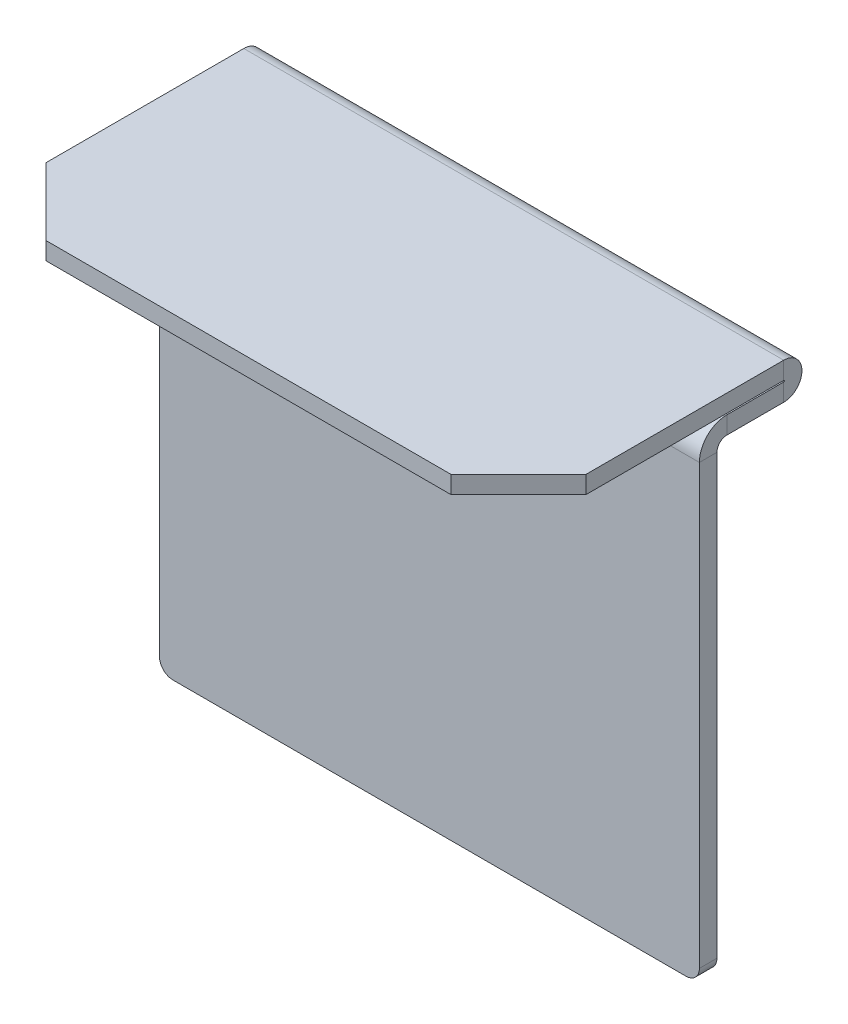
ISO-10303-21;
HEADER;
FILE_DESCRIPTION(('STEP AP214'),'2;1');
FILE_NAME('part.step','',(''),(''),'','','');
FILE_SCHEMA(('AUTOMOTIVE_DESIGN { 1 0 10303 214 1 1 1 1 }'));
ENDSEC;
DATA;
#1=APPLICATION_CONTEXT('core data for automotive mechanical design processes');
#2=APPLICATION_PROTOCOL_DEFINITION('international standard','automotive_design',2000,#1);
#3=PRODUCT_CONTEXT('',#1,'mechanical');
#4=PRODUCT('Part','Part','',(#3));
#5=PRODUCT_RELATED_PRODUCT_CATEGORY('part','',(#4));
#6=PRODUCT_DEFINITION_FORMATION('','',#4);
#7=PRODUCT_DEFINITION_CONTEXT('part definition',#1,'design');
#8=PRODUCT_DEFINITION('design','',#6,#7);
#9=PRODUCT_DEFINITION_SHAPE('','',#8);
#10=(LENGTH_UNIT() NAMED_UNIT(*) SI_UNIT(.MILLI.,.METRE.));
#11=(NAMED_UNIT(*) PLANE_ANGLE_UNIT() SI_UNIT($,.RADIAN.));
#12=(NAMED_UNIT(*) SI_UNIT($,.STERADIAN.) SOLID_ANGLE_UNIT());
#13=UNCERTAINTY_MEASURE_WITH_UNIT(LENGTH_MEASURE(1.E-05),#10,'distance_accuracy_value','');
#14=(GEOMETRIC_REPRESENTATION_CONTEXT(3) GLOBAL_UNCERTAINTY_ASSIGNED_CONTEXT((#13)) GLOBAL_UNIT_ASSIGNED_CONTEXT((#10,
#11,#12)) REPRESENTATION_CONTEXT('',''));
#15=CARTESIAN_POINT('',(0.,0.,0.));
#16=DIRECTION('',(0.,0.,1.));
#17=DIRECTION('',(1.,0.,0.));
#18=AXIS2_PLACEMENT_3D('',#15,#16,#17);
#19=CARTESIAN_POINT('',(40.,34.1975669066332,32.6024330933669));
#20=DIRECTION('',(1.,0.,0.));
#21=DIRECTION('',(0.,-1.,0.));
#22=AXIS2_PLACEMENT_3D('',#19,#20,#21);
#23=PLANE('',#22);
#24=DIRECTION('',(0.,0.,-1.));
#25=VECTOR('',#24,1.);
#26=CARTESIAN_POINT('',(40.,35.4975669066332,32.6024330933669));
#27=LINE('',#26,#25);
#28=CARTESIAN_POINT('',(40.,35.4975669066331,-2.03660000000001));
#29=VERTEX_POINT('',#28);
#30=CARTESIAN_POINT('',(40.,35.4975669066331,-6.24800947787667));
#31=VERTEX_POINT('',#30);
#32=EDGE_CURVE('E70',#29,#31,#27,.T.);
#33=ORIENTED_EDGE('',*,*,#32,.F.);
#34=DIRECTION('',(0.,-1.,0.));
#35=VECTOR('',#34,1.);
#36=CARTESIAN_POINT('',(40.,34.1975669066333,-2.03660000000001));
#37=LINE('',#36,#35);
#38=CARTESIAN_POINT('',(40.,34.1975669066331,-2.03660000000001));
#39=VERTEX_POINT('',#38);
#40=EDGE_CURVE('E159',#29,#39,#37,.T.);
#41=ORIENTED_EDGE('',*,*,#40,.T.);
#42=DIRECTION('',(0.,0.,-1.));
#43=VECTOR('',#42,1.);
#44=CARTESIAN_POINT('',(40.,34.1975669066332,32.6024330933669));
#45=LINE('',#44,#43);
#46=CARTESIAN_POINT('',(40.,34.1975669066331,-6.24800947787667));
#47=VERTEX_POINT('',#46);
#48=EDGE_CURVE('E50',#39,#47,#45,.T.);
#49=ORIENTED_EDGE('',*,*,#48,.T.);
#50=DIRECTION('',(0.,1.,0.));
#51=VECTOR('',#50,1.);
#52=CARTESIAN_POINT('',(40.,34.1975669066334,-6.24800947787667));
#53=LINE('',#52,#51);
#54=EDGE_CURVE('E175',#47,#31,#53,.T.);
#55=ORIENTED_EDGE('',*,*,#54,.T.);
#56=EDGE_LOOP('',(#33,#41,#49,#55));
#57=FACE_BOUND('',#56,.T.);
#58=ADVANCED_FACE('F46',(#57),#23,.T.);
#59=CARTESIAN_POINT('',(39.,35.4975669066332,32.6024330933669));
#60=DIRECTION('',(0.,1.,0.));
#61=DIRECTION('',(1.,0.,0.));
#62=AXIS2_PLACEMENT_3D('',#59,#60,#61);
#63=PLANE('',#62);
#64=DIRECTION('',(0.,0.,1.));
#65=VECTOR('',#64,1.);
#66=CARTESIAN_POINT('',(0.,35.4975669066332,32.6024330933669));
#67=LINE('',#66,#65);
#68=CARTESIAN_POINT('',(0.,35.4975669066331,-6.24800947787667));
#69=VERTEX_POINT('',#68);
#70=CARTESIAN_POINT('',(0.,35.4975669066331,-2.0366));
#71=VERTEX_POINT('',#70);
#72=EDGE_CURVE('E63',#69,#71,#67,.T.);
#73=ORIENTED_EDGE('',*,*,#72,.T.);
#74=DIRECTION('',(1.,0.,0.));
#75=VECTOR('',#74,1.);
#76=CARTESIAN_POINT('',(39.,35.4975669066331,-2.03660000000001));
#77=LINE('',#76,#75);
#78=EDGE_CURVE('E55',#71,#29,#77,.T.);
#79=ORIENTED_EDGE('',*,*,#78,.T.);
#80=ORIENTED_EDGE('',*,*,#32,.T.);
#81=DIRECTION('',(-1.,0.,0.));
#82=VECTOR('',#81,1.);
#83=CARTESIAN_POINT('',(39.,35.4975669066331,-6.24800947787667));
#84=LINE('',#83,#82);
#85=EDGE_CURVE('E259',#31,#69,#84,.T.);
#86=ORIENTED_EDGE('',*,*,#85,.T.);
#87=EDGE_LOOP('',(#73,#79,#80,#86));
#88=FACE_BOUND('',#87,.T.);
#89=ADVANCED_FACE('F311',(#88),#63,.T.);
#90=CARTESIAN_POINT('',(0.,34.1975669066332,32.6024330933669));
#91=DIRECTION('',(-1.,0.,0.));
#92=DIRECTION('',(0.,1.,0.));
#93=AXIS2_PLACEMENT_3D('',#90,#91,#92);
#94=PLANE('',#93);
#95=DIRECTION('',(0.,0.,1.));
#96=VECTOR('',#95,1.);
#97=CARTESIAN_POINT('',(0.,34.1975669066332,32.6024330933669));
#98=LINE('',#97,#96);
#99=CARTESIAN_POINT('',(0.,34.1975669066331,-6.24800947787667));
#100=VERTEX_POINT('',#99);
#101=CARTESIAN_POINT('',(0.,34.1975669066331,-2.0366));
#102=VERTEX_POINT('',#101);
#103=EDGE_CURVE('E258',#100,#102,#98,.T.);
#104=ORIENTED_EDGE('',*,*,#103,.T.);
#105=DIRECTION('',(0.,1.,0.));
#106=VECTOR('',#105,1.);
#107=CARTESIAN_POINT('',(0.,34.1975669066333,-2.03659999999999));
#108=LINE('',#107,#106);
#109=EDGE_CURVE('E12',#102,#71,#108,.T.);
#110=ORIENTED_EDGE('',*,*,#109,.T.);
#111=ORIENTED_EDGE('',*,*,#72,.F.);
#112=DIRECTION('',(0.,-1.,0.));
#113=VECTOR('',#112,1.);
#114=CARTESIAN_POINT('',(0.,34.1975669066334,-6.24800947787667));
#115=LINE('',#114,#113);
#116=EDGE_CURVE('E255',#69,#100,#115,.T.);
#117=ORIENTED_EDGE('',*,*,#116,.T.);
#118=EDGE_LOOP('',(#104,#110,#111,#117));
#119=FACE_BOUND('',#118,.T.);
#120=ADVANCED_FACE('F48',(#119),#94,.T.);
#121=CARTESIAN_POINT('',(39.,36.8975669066332,-47.2975669066331));
#122=DIRECTION('',(0.,-1.,0.));
#123=DIRECTION('',(1.,0.,0.));
#124=AXIS2_PLACEMENT_3D('',#121,#122,#123);
#125=PLANE('',#124);
#126=DIRECTION('',(0.,0.,1.));
#127=VECTOR('',#126,1.);
#128=CARTESIAN_POINT('',(40.,36.8975669066332,-47.2975669066331));
#129=LINE('',#128,#127);
#130=CARTESIAN_POINT('',(40.,36.8975669066331,-6.24800947787666));
#131=VERTEX_POINT('',#130);
#132=CARTESIAN_POINT('',(40.,36.897566906633,8.40243309336692));
#133=VERTEX_POINT('',#132);
#134=EDGE_CURVE('E267',#131,#133,#129,.T.);
#135=ORIENTED_EDGE('',*,*,#134,.F.);
#136=DIRECTION('',(-1.,0.,0.));
#137=VECTOR('',#136,1.);
#138=CARTESIAN_POINT('',(39.,36.8975669066331,-6.24800947787666));
#139=LINE('',#138,#137);
#140=CARTESIAN_POINT('',(0.,36.8975669066331,-6.24800947787668));
#141=VERTEX_POINT('',#140);
#142=EDGE_CURVE('E287',#131,#141,#139,.T.);
#143=ORIENTED_EDGE('',*,*,#142,.T.);
#144=DIRECTION('',(0.,0.,-1.));
#145=VECTOR('',#144,1.);
#146=CARTESIAN_POINT('',(0.,36.8975669066332,-47.2975669066331));
#147=LINE('',#146,#145);
#148=CARTESIAN_POINT('',(0.,36.897566906633,8.40243309336692));
#149=VERTEX_POINT('',#148);
#150=EDGE_CURVE('E284',#149,#141,#147,.T.);
#151=ORIENTED_EDGE('',*,*,#150,.F.);
#152=DIRECTION('',(-0.707106781186546,0.,-0.707106781186549));
#153=VECTOR('',#152,1.);
#154=CARTESIAN_POINT('',(0.,36.897566906633,8.40243309336692));
#155=LINE('',#154,#153);
#156=CARTESIAN_POINT('',(4.99999999999998,36.897566906633,13.4024330933669));
#157=VERTEX_POINT('',#156);
#158=EDGE_CURVE('E270',#157,#149,#155,.T.);
#159=ORIENTED_EDGE('',*,*,#158,.F.);
#160=DIRECTION('',(-1.,0.,0.));
#161=VECTOR('',#160,1.);
#162=CARTESIAN_POINT('',(4.99999999999998,36.897566906633,13.4024330933669));
#163=LINE('',#162,#161);
#164=CARTESIAN_POINT('',(35.,36.897566906633,13.4024330933669));
#165=VERTEX_POINT('',#164);
#166=EDGE_CURVE('E266',#165,#157,#163,.T.);
#167=ORIENTED_EDGE('',*,*,#166,.F.);
#168=DIRECTION('',(-0.707106781186548,0.,0.707106781186547));
#169=VECTOR('',#168,1.);
#170=CARTESIAN_POINT('',(35.,36.897566906633,13.4024330933669));
#171=LINE('',#170,#169);
#172=EDGE_CURVE('E263',#133,#165,#171,.T.);
#173=ORIENTED_EDGE('',*,*,#172,.F.);
#174=EDGE_LOOP('',(#135,#143,#151,#159,#167,#173));
#175=FACE_BOUND('',#174,.T.);
#176=ADVANCED_FACE('F377',(#175),#125,.F.);
#177=CARTESIAN_POINT('',(0.,36.8975669066332,-47.2975669066331));
#178=DIRECTION('',(-1.,0.,0.));
#179=DIRECTION('',(0.,-1.,0.));
#180=AXIS2_PLACEMENT_3D('',#177,#178,#179);
#181=PLANE('',#180);
#182=DIRECTION('',(0.,1.,0.));
#183=VECTOR('',#182,1.);
#184=CARTESIAN_POINT('',(0.,36.8975669066328,-6.24800947787666));
#185=LINE('',#184,#183);
#186=CARTESIAN_POINT('',(0.,35.5975669066331,-6.24800947787667));
#187=VERTEX_POINT('',#186);
#188=EDGE_CURVE('E184',#187,#141,#185,.T.);
#189=ORIENTED_EDGE('',*,*,#188,.F.);
#190=DIRECTION('',(0.,0.,-1.));
#191=VECTOR('',#190,1.);
#192=CARTESIAN_POINT('',(0.,35.5975669066332,-47.2975669066331));
#193=LINE('',#192,#191);
#194=CARTESIAN_POINT('',(0.,35.597566906633,8.40243309336691));
#195=VERTEX_POINT('',#194);
#196=EDGE_CURVE('E305',#195,#187,#193,.T.);
#197=ORIENTED_EDGE('',*,*,#196,.F.);
#198=DIRECTION('',(0.,-1.,0.));
#199=VECTOR('',#198,1.);
#200=CARTESIAN_POINT('',(0.,36.897566906633,8.40243309336692));
#201=LINE('',#200,#199);
#202=EDGE_CURVE('E285',#149,#195,#201,.T.);
#203=ORIENTED_EDGE('',*,*,#202,.F.);
#204=ORIENTED_EDGE('',*,*,#150,.T.);
#205=EDGE_LOOP('',(#189,#197,#203,#204));
#206=FACE_BOUND('',#205,.T.);
#207=ADVANCED_FACE('F373',(#206),#181,.T.);
#208=CARTESIAN_POINT('',(0.,36.897566906633,8.40243309336692));
#209=DIRECTION('',(-0.707106781186549,0.,0.707106781186546));
#210=DIRECTION('',(-0.707106781186546,0.,-0.707106781186549));
#211=AXIS2_PLACEMENT_3D('',#208,#209,#210);
#212=PLANE('',#211);
#213=DIRECTION('',(-0.707106781186546,0.,-0.707106781186549));
#214=VECTOR('',#213,1.);
#215=CARTESIAN_POINT('',(0.,35.597566906633,8.40243309336691));
#216=LINE('',#215,#214);
#217=CARTESIAN_POINT('',(4.99999999999998,35.597566906633,13.4024330933669));
#218=VERTEX_POINT('',#217);
#219=EDGE_CURVE('E281',#218,#195,#216,.T.);
#220=ORIENTED_EDGE('',*,*,#219,.F.);
#221=DIRECTION('',(0.,-1.,0.));
#222=VECTOR('',#221,1.);
#223=CARTESIAN_POINT('',(4.99999999999998,36.897566906633,13.4024330933669));
#224=LINE('',#223,#222);
#225=EDGE_CURVE('E288',#157,#218,#224,.T.);
#226=ORIENTED_EDGE('',*,*,#225,.F.);
#227=ORIENTED_EDGE('',*,*,#158,.T.);
#228=ORIENTED_EDGE('',*,*,#202,.T.);
#229=EDGE_LOOP('',(#220,#226,#227,#228));
#230=FACE_BOUND('',#229,.T.);
#231=ADVANCED_FACE('F376',(#230),#212,.T.);
#232=CARTESIAN_POINT('',(4.99999999999998,36.897566906633,13.4024330933669));
#233=DIRECTION('',(0.,0.,1.));
#234=DIRECTION('',(0.,-1.,0.));
#235=AXIS2_PLACEMENT_3D('',#232,#233,#234);
#236=PLANE('',#235);
#237=DIRECTION('',(-1.,0.,0.));
#238=VECTOR('',#237,1.);
#239=CARTESIAN_POINT('',(4.99999999999998,35.597566906633,13.4024330933669));
#240=LINE('',#239,#238);
#241=CARTESIAN_POINT('',(35.,35.597566906633,13.4024330933669));
#242=VERTEX_POINT('',#241);
#243=EDGE_CURVE('E277',#242,#218,#240,.T.);
#244=ORIENTED_EDGE('',*,*,#243,.F.);
#245=DIRECTION('',(0.,-1.,0.));
#246=VECTOR('',#245,1.);
#247=CARTESIAN_POINT('',(35.,36.897566906633,13.4024330933669));
#248=LINE('',#247,#246);
#249=EDGE_CURVE('E290',#165,#242,#248,.T.);
#250=ORIENTED_EDGE('',*,*,#249,.F.);
#251=ORIENTED_EDGE('',*,*,#166,.T.);
#252=ORIENTED_EDGE('',*,*,#225,.T.);
#253=EDGE_LOOP('',(#244,#250,#251,#252));
#254=FACE_BOUND('',#253,.T.);
#255=ADVANCED_FACE('F392',(#254),#236,.T.);
#256=CARTESIAN_POINT('',(35.,36.897566906633,13.4024330933669));
#257=DIRECTION('',(0.707106781186547,0.,0.707106781186548));
#258=DIRECTION('',(-0.707106781186548,0.,0.707106781186547));
#259=AXIS2_PLACEMENT_3D('',#256,#257,#258);
#260=PLANE('',#259);
#261=DIRECTION('',(-0.707106781186548,0.,0.707106781186547));
#262=VECTOR('',#261,1.);
#263=CARTESIAN_POINT('',(35.,35.597566906633,13.4024330933669));
#264=LINE('',#263,#262);
#265=CARTESIAN_POINT('',(40.,35.597566906633,8.40243309336692));
#266=VERTEX_POINT('',#265);
#267=EDGE_CURVE('E274',#266,#242,#264,.T.);
#268=ORIENTED_EDGE('',*,*,#267,.F.);
#269=DIRECTION('',(0.,-1.,0.));
#270=VECTOR('',#269,1.);
#271=CARTESIAN_POINT('',(40.,36.897566906633,8.40243309336692));
#272=LINE('',#271,#270);
#273=EDGE_CURVE('E273',#133,#266,#272,.T.);
#274=ORIENTED_EDGE('',*,*,#273,.F.);
#275=ORIENTED_EDGE('',*,*,#172,.T.);
#276=ORIENTED_EDGE('',*,*,#249,.T.);
#277=EDGE_LOOP('',(#268,#274,#275,#276));
#278=FACE_BOUND('',#277,.T.);
#279=ADVANCED_FACE('F385',(#278),#260,.T.);
#280=CARTESIAN_POINT('',(40.,36.8975669066332,-47.2975669066331));
#281=DIRECTION('',(1.,0.,0.));
#282=DIRECTION('',(0.,1.,0.));
#283=AXIS2_PLACEMENT_3D('',#280,#281,#282);
#284=PLANE('',#283);
#285=DIRECTION('',(0.,-1.,0.));
#286=VECTOR('',#285,1.);
#287=CARTESIAN_POINT('',(40.,36.8975669066328,-6.24800947787666));
#288=LINE('',#287,#286);
#289=CARTESIAN_POINT('',(40.,35.5975669066331,-6.24800947787667));
#290=VERTEX_POINT('',#289);
#291=EDGE_CURVE('E296',#131,#290,#288,.T.);
#292=ORIENTED_EDGE('',*,*,#291,.F.);
#293=ORIENTED_EDGE('',*,*,#134,.T.);
#294=ORIENTED_EDGE('',*,*,#273,.T.);
#295=DIRECTION('',(0.,0.,1.));
#296=VECTOR('',#295,1.);
#297=CARTESIAN_POINT('',(40.,35.5975669066332,-47.2975669066331));
#298=LINE('',#297,#296);
#299=EDGE_CURVE('E278',#290,#266,#298,.T.);
#300=ORIENTED_EDGE('',*,*,#299,.F.);
#301=EDGE_LOOP('',(#292,#293,#294,#300));
#302=FACE_BOUND('',#301,.T.);
#303=ADVANCED_FACE('F381',(#302),#284,.T.);
#304=CARTESIAN_POINT('',(39.,35.5975669066332,-47.2975669066331));
#305=DIRECTION('',(0.,-1.,0.));
#306=DIRECTION('',(1.,0.,0.));
#307=AXIS2_PLACEMENT_3D('',#304,#305,#306);
#308=PLANE('',#307);
#309=DIRECTION('',(-1.,0.,0.));
#310=VECTOR('',#309,1.);
#311=CARTESIAN_POINT('',(39.,35.5975669066331,-6.24800947787667));
#312=LINE('',#311,#310);
#313=EDGE_CURVE('E299',#290,#187,#312,.T.);
#314=ORIENTED_EDGE('',*,*,#313,.F.);
#315=ORIENTED_EDGE('',*,*,#299,.T.);
#316=ORIENTED_EDGE('',*,*,#267,.T.);
#317=ORIENTED_EDGE('',*,*,#243,.T.);
#318=ORIENTED_EDGE('',*,*,#219,.T.);
#319=ORIENTED_EDGE('',*,*,#196,.T.);
#320=EDGE_LOOP('',(#314,#315,#316,#317,#318,#319));
#321=FACE_BOUND('',#320,.T.);
#322=ADVANCED_FACE('F372',(#321),#308,.T.);
#323=CARTESIAN_POINT('',(39.,34.1975669066332,32.6024330933669));
#324=DIRECTION('',(0.,1.,0.));
#325=DIRECTION('',(1.,0.,0.));
#326=AXIS2_PLACEMENT_3D('',#323,#324,#325);
#327=PLANE('',#326);
#328=DIRECTION('',(1.,0.,0.));
#329=VECTOR('',#328,1.);
#330=CARTESIAN_POINT('',(39.,34.1975669066331,-2.03660000000001));
#331=LINE('',#330,#329);
#332=EDGE_CURVE('E166',#102,#39,#331,.T.);
#333=ORIENTED_EDGE('',*,*,#332,.F.);
#334=ORIENTED_EDGE('',*,*,#103,.F.);
#335=DIRECTION('',(-1.,0.,0.));
#336=VECTOR('',#335,1.);
#337=CARTESIAN_POINT('',(39.,34.1975669066331,-6.24800947787667));
#338=LINE('',#337,#336);
#339=EDGE_CURVE('E174',#47,#100,#338,.T.);
#340=ORIENTED_EDGE('',*,*,#339,.F.);
#341=ORIENTED_EDGE('',*,*,#48,.F.);
#342=EDGE_LOOP('',(#333,#334,#340,#341));
#343=FACE_BOUND('',#342,.T.);
#344=ADVANCED_FACE('F171',(#343),#327,.F.);
#345=CARTESIAN_POINT('',(40.,35.5475669066331,-6.24800947787667));
#346=DIRECTION('',(1.,0.,0.));
#347=DIRECTION('',(0.,-1.,0.));
#348=AXIS2_PLACEMENT_3D('',#345,#346,#347);
#349=PLANE('',#348);
#350=ORIENTED_EDGE('',*,*,#291,.T.);
#351=CARTESIAN_POINT('',(40.,35.5475669066331,-6.24800947787667));
#352=DIRECTION('',(1.,0.,0.));
#353=DIRECTION('',(0.,-1.,0.));
#354=AXIS2_PLACEMENT_3D('',#351,#352,#353);
#355=CIRCLE('',#354,0.0499999999999999);
#356=EDGE_CURVE('E205',#290,#31,#355,.F.);
#357=ORIENTED_EDGE('',*,*,#356,.T.);
#358=ORIENTED_EDGE('',*,*,#54,.F.);
#359=CARTESIAN_POINT('',(40.,35.5475669066331,-6.24800947787667));
#360=DIRECTION('',(-1.,0.,0.));
#361=DIRECTION('',(0.,-1.,0.));
#362=AXIS2_PLACEMENT_3D('',#359,#360,#361);
#363=CIRCLE('',#362,1.35);
#364=EDGE_CURVE('E244',#131,#47,#363,.T.);
#365=ORIENTED_EDGE('',*,*,#364,.F.);
#366=EDGE_LOOP('',(#350,#357,#358,#365));
#367=FACE_BOUND('',#366,.T.);
#368=ADVANCED_FACE('F316',(#367),#349,.T.);
#369=CARTESIAN_POINT('',(0.,35.5475669066331,-6.24800947787667));
#370=DIRECTION('',(-1.,0.,0.));
#371=DIRECTION('',(0.,0.,1.));
#372=AXIS2_PLACEMENT_3D('',#369,#370,#371);
#373=PLANE('',#372);
#374=ORIENTED_EDGE('',*,*,#116,.F.);
#375=CARTESIAN_POINT('',(0.,35.5475669066331,-6.24800947787667));
#376=DIRECTION('',(1.,0.,0.));
#377=DIRECTION('',(0.,-1.,0.));
#378=AXIS2_PLACEMENT_3D('',#375,#376,#377);
#379=CIRCLE('',#378,0.0499999999999999);
#380=EDGE_CURVE('E248',#69,#187,#379,.T.);
#381=ORIENTED_EDGE('',*,*,#380,.T.);
#382=ORIENTED_EDGE('',*,*,#188,.T.);
#383=CARTESIAN_POINT('',(0.,35.5475669066331,-6.24800947787667));
#384=DIRECTION('',(1.,0.,0.));
#385=DIRECTION('',(0.,0.,1.));
#386=AXIS2_PLACEMENT_3D('',#383,#384,#385);
#387=CIRCLE('',#386,1.35);
#388=EDGE_CURVE('E247',#100,#141,#387,.T.);
#389=ORIENTED_EDGE('',*,*,#388,.F.);
#390=EDGE_LOOP('',(#374,#381,#382,#389));
#391=FACE_BOUND('',#390,.T.);
#392=ADVANCED_FACE('F402',(#391),#373,.T.);
#393=CARTESIAN_POINT('',(-20.081493312457,35.5475669066331,-6.24800947787667));
#394=DIRECTION('',(1.,0.,0.));
#395=DIRECTION('',(0.,-1.,0.));
#396=AXIS2_PLACEMENT_3D('',#393,#394,#395);
#397=CYLINDRICAL_SURFACE('',#396,1.35);
#398=ORIENTED_EDGE('',*,*,#388,.T.);
#399=ORIENTED_EDGE('',*,*,#142,.F.);
#400=ORIENTED_EDGE('',*,*,#364,.T.);
#401=ORIENTED_EDGE('',*,*,#339,.T.);
#402=EDGE_LOOP('',(#398,#399,#400,#401));
#403=FACE_BOUND('',#402,.T.);
#404=ADVANCED_FACE('F405',(#403),#397,.T.);
#405=CARTESIAN_POINT('',(-20.081493312457,35.5475669066331,-6.24800947787667));
#406=DIRECTION('',(1.,0.,0.));
#407=DIRECTION('',(0.,-1.,0.));
#408=AXIS2_PLACEMENT_3D('',#405,#406,#407);
#409=CYLINDRICAL_SURFACE('',#408,0.0499999999999999);
#410=ORIENTED_EDGE('',*,*,#380,.F.);
#411=ORIENTED_EDGE('',*,*,#85,.F.);
#412=ORIENTED_EDGE('',*,*,#356,.F.);
#413=ORIENTED_EDGE('',*,*,#313,.T.);
#414=EDGE_LOOP('',(#410,#411,#412,#413));
#415=FACE_BOUND('',#414,.T.);
#416=ADVANCED_FACE('F321',(#415),#409,.F.);
#417=CARTESIAN_POINT('',(1.,1.,-1.3));
#418=DIRECTION('',(0.,0.,1.));
#419=DIRECTION('',(1.,0.,0.));
#420=AXIS2_PLACEMENT_3D('',#417,#418,#419);
#421=CYLINDRICAL_SURFACE('',#420,1.);
#422=CARTESIAN_POINT('',(1.,1.,0.));
#423=DIRECTION('',(0.,0.,1.));
#424=DIRECTION('',(-1.,0.,0.));
#425=AXIS2_PLACEMENT_3D('',#422,#423,#424);
#426=CIRCLE('',#425,1.);
#427=CARTESIAN_POINT('',(0.,1.,0.));
#428=VERTEX_POINT('',#427);
#429=CARTESIAN_POINT('',(1.,0.,0.));
#430=VERTEX_POINT('',#429);
#431=EDGE_CURVE('E216',#428,#430,#426,.T.);
#432=ORIENTED_EDGE('',*,*,#431,.F.);
#433=DIRECTION('',(0.,0.,1.));
#434=VECTOR('',#433,1.);
#435=CARTESIAN_POINT('',(0.,1.,-1.3));
#436=LINE('',#435,#434);
#437=CARTESIAN_POINT('',(0.,1.,-1.3));
#438=VERTEX_POINT('',#437);
#439=EDGE_CURVE('E202',#438,#428,#436,.T.);
#440=ORIENTED_EDGE('',*,*,#439,.F.);
#441=CARTESIAN_POINT('',(1.,1.,-1.3));
#442=DIRECTION('',(0.,0.,1.));
#443=DIRECTION('',(-1.,0.,0.));
#444=AXIS2_PLACEMENT_3D('',#441,#442,#443);
#445=CIRCLE('',#444,1.);
#446=CARTESIAN_POINT('',(1.,0.,-1.3));
#447=VERTEX_POINT('',#446);
#448=EDGE_CURVE('E238',#438,#447,#445,.T.);
#449=ORIENTED_EDGE('',*,*,#448,.T.);
#450=DIRECTION('',(0.,0.,1.));
#451=VECTOR('',#450,1.);
#452=CARTESIAN_POINT('',(1.,0.,-1.3));
#453=LINE('',#452,#451);
#454=EDGE_CURVE('E236',#447,#430,#453,.T.);
#455=ORIENTED_EDGE('',*,*,#454,.T.);
#456=EDGE_LOOP('',(#432,#440,#449,#455));
#457=FACE_BOUND('',#456,.T.);
#458=ADVANCED_FACE('F350',(#457),#421,.T.);
#459=CARTESIAN_POINT('',(1.,0.,-1.3));
#460=DIRECTION('',(0.,-1.,0.));
#461=DIRECTION('',(0.,0.,-1.));
#462=AXIS2_PLACEMENT_3D('',#459,#460,#461);
#463=PLANE('',#462);
#464=DIRECTION('',(1.,0.,0.));
#465=VECTOR('',#464,1.);
#466=CARTESIAN_POINT('',(1.,0.,0.));
#467=LINE('',#466,#465);
#468=CARTESIAN_POINT('',(39.,0.,0.));
#469=VERTEX_POINT('',#468);
#470=EDGE_CURVE('E213',#430,#469,#467,.T.);
#471=ORIENTED_EDGE('',*,*,#470,.F.);
#472=ORIENTED_EDGE('',*,*,#454,.F.);
#473=DIRECTION('',(1.,0.,0.));
#474=VECTOR('',#473,1.);
#475=CARTESIAN_POINT('',(1.,0.,-1.3));
#476=LINE('',#475,#474);
#477=CARTESIAN_POINT('',(39.,0.,-1.3));
#478=VERTEX_POINT('',#477);
#479=EDGE_CURVE('E233',#447,#478,#476,.T.);
#480=ORIENTED_EDGE('',*,*,#479,.T.);
#481=DIRECTION('',(0.,0.,1.));
#482=VECTOR('',#481,1.);
#483=CARTESIAN_POINT('',(39.,0.,-1.3));
#484=LINE('',#483,#482);
#485=EDGE_CURVE('E231',#478,#469,#484,.T.);
#486=ORIENTED_EDGE('',*,*,#485,.T.);
#487=EDGE_LOOP('',(#471,#472,#480,#486));
#488=FACE_BOUND('',#487,.T.);
#489=ADVANCED_FACE('F353',(#488),#463,.T.);
#490=CARTESIAN_POINT('',(39.,1.,-1.3));
#491=DIRECTION('',(0.,0.,1.));
#492=DIRECTION('',(1.,0.,0.));
#493=AXIS2_PLACEMENT_3D('',#490,#491,#492);
#494=CYLINDRICAL_SURFACE('',#493,1.);
#495=CARTESIAN_POINT('',(39.,1.,0.));
#496=DIRECTION('',(0.,0.,1.));
#497=DIRECTION('',(1.,0.,0.));
#498=AXIS2_PLACEMENT_3D('',#495,#496,#497);
#499=CIRCLE('',#498,1.);
#500=CARTESIAN_POINT('',(40.,1.,0.));
#501=VERTEX_POINT('',#500);
#502=EDGE_CURVE('E210',#469,#501,#499,.T.);
#503=ORIENTED_EDGE('',*,*,#502,.F.);
#504=ORIENTED_EDGE('',*,*,#485,.F.);
#505=CARTESIAN_POINT('',(39.,1.,-1.3));
#506=DIRECTION('',(0.,0.,1.));
#507=DIRECTION('',(1.,0.,0.));
#508=AXIS2_PLACEMENT_3D('',#505,#506,#507);
#509=CIRCLE('',#508,1.);
#510=CARTESIAN_POINT('',(40.,1.,-1.3));
#511=VERTEX_POINT('',#510);
#512=EDGE_CURVE('E228',#478,#511,#509,.T.);
#513=ORIENTED_EDGE('',*,*,#512,.T.);
#514=DIRECTION('',(0.,0.,1.));
#515=VECTOR('',#514,1.);
#516=CARTESIAN_POINT('',(40.,1.,-1.3));
#517=LINE('',#516,#515);
#518=EDGE_CURVE('E226',#511,#501,#517,.T.);
#519=ORIENTED_EDGE('',*,*,#518,.T.);
#520=EDGE_LOOP('',(#503,#504,#513,#519));
#521=FACE_BOUND('',#520,.T.);
#522=ADVANCED_FACE('F355',(#521),#494,.T.);
#523=CARTESIAN_POINT('',(39.,1.,-1.3));
#524=DIRECTION('',(0.,0.,1.));
#525=DIRECTION('',(1.,0.,0.));
#526=AXIS2_PLACEMENT_3D('',#523,#524,#525);
#527=PLANE('',#526);
#528=DIRECTION('',(0.,-1.,0.));
#529=VECTOR('',#528,1.);
#530=CARTESIAN_POINT('',(0.,1.,-1.3));
#531=LINE('',#530,#529);
#532=CARTESIAN_POINT('',(0.,33.4609669066331,-1.3));
#533=VERTEX_POINT('',#532);
#534=EDGE_CURVE('E206',#533,#438,#531,.T.);
#535=ORIENTED_EDGE('',*,*,#534,.F.);
#536=DIRECTION('',(1.,0.,0.));
#537=VECTOR('',#536,1.);
#538=CARTESIAN_POINT('',(39.,33.4609669066331,-1.3));
#539=LINE('',#538,#537);
#540=CARTESIAN_POINT('',(40.,33.4609669066331,-1.3));
#541=VERTEX_POINT('',#540);
#542=EDGE_CURVE('E223',#533,#541,#539,.T.);
#543=ORIENTED_EDGE('',*,*,#542,.T.);
#544=DIRECTION('',(0.,1.,0.));
#545=VECTOR('',#544,1.);
#546=CARTESIAN_POINT('',(40.,1.,-1.3));
#547=LINE('',#546,#545);
#548=EDGE_CURVE('E221',#511,#541,#547,.T.);
#549=ORIENTED_EDGE('',*,*,#548,.F.);
#550=ORIENTED_EDGE('',*,*,#512,.F.);
#551=ORIENTED_EDGE('',*,*,#479,.F.);
#552=ORIENTED_EDGE('',*,*,#448,.F.);
#553=EDGE_LOOP('',(#535,#543,#549,#550,#551,#552));
#554=FACE_BOUND('',#553,.T.);
#555=ADVANCED_FACE('F346',(#554),#527,.F.);
#556=CARTESIAN_POINT('',(40.,1.,-1.3));
#557=DIRECTION('',(1.,0.,0.));
#558=DIRECTION('',(0.,0.,-1.));
#559=AXIS2_PLACEMENT_3D('',#556,#557,#558);
#560=PLANE('',#559);
#561=DIRECTION('',(0.,0.,-1.));
#562=VECTOR('',#561,1.);
#563=CARTESIAN_POINT('',(40.,33.4609669066331,-1.29999999999977));
#564=LINE('',#563,#562);
#565=CARTESIAN_POINT('',(40.,33.4609669066331,0.));
#566=VERTEX_POINT('',#565);
#567=EDGE_CURVE('E189',#566,#541,#564,.T.);
#568=ORIENTED_EDGE('',*,*,#567,.F.);
#569=DIRECTION('',(0.,1.,0.));
#570=VECTOR('',#569,1.);
#571=CARTESIAN_POINT('',(40.,1.,0.));
#572=LINE('',#571,#570);
#573=EDGE_CURVE('E208',#501,#566,#572,.T.);
#574=ORIENTED_EDGE('',*,*,#573,.F.);
#575=ORIENTED_EDGE('',*,*,#518,.F.);
#576=ORIENTED_EDGE('',*,*,#548,.T.);
#577=EDGE_LOOP('',(#568,#574,#575,#576));
#578=FACE_BOUND('',#577,.T.);
#579=ADVANCED_FACE('F342',(#578),#560,.T.);
#580=CARTESIAN_POINT('',(39.,1.,0.));
#581=DIRECTION('',(0.,0.,1.));
#582=DIRECTION('',(1.,0.,0.));
#583=AXIS2_PLACEMENT_3D('',#580,#581,#582);
#584=PLANE('',#583);
#585=DIRECTION('',(1.,0.,0.));
#586=VECTOR('',#585,1.);
#587=CARTESIAN_POINT('',(39.,33.4609669066331,0.));
#588=LINE('',#587,#586);
#589=CARTESIAN_POINT('',(0.,33.4609669066331,0.));
#590=VERTEX_POINT('',#589);
#591=EDGE_CURVE('E193',#590,#566,#588,.T.);
#592=ORIENTED_EDGE('',*,*,#591,.F.);
#593=DIRECTION('',(0.,-1.,0.));
#594=VECTOR('',#593,1.);
#595=CARTESIAN_POINT('',(0.,1.,0.));
#596=LINE('',#595,#594);
#597=EDGE_CURVE('E219',#590,#428,#596,.T.);
#598=ORIENTED_EDGE('',*,*,#597,.T.);
#599=ORIENTED_EDGE('',*,*,#431,.T.);
#600=ORIENTED_EDGE('',*,*,#470,.T.);
#601=ORIENTED_EDGE('',*,*,#502,.T.);
#602=ORIENTED_EDGE('',*,*,#573,.T.);
#603=EDGE_LOOP('',(#592,#598,#599,#600,#601,#602));
#604=FACE_BOUND('',#603,.T.);
#605=ADVANCED_FACE('F338',(#604),#584,.T.);
#606=CARTESIAN_POINT('',(0.,1.,-1.3));
#607=DIRECTION('',(-1.,0.,0.));
#608=DIRECTION('',(0.,0.,1.));
#609=AXIS2_PLACEMENT_3D('',#606,#607,#608);
#610=PLANE('',#609);
#611=DIRECTION('',(0.,0.,1.));
#612=VECTOR('',#611,1.);
#613=CARTESIAN_POINT('',(0.,33.4609669066331,-1.29999999999977));
#614=LINE('',#613,#612);
#615=EDGE_CURVE('E190',#533,#590,#614,.T.);
#616=ORIENTED_EDGE('',*,*,#615,.F.);
#617=ORIENTED_EDGE('',*,*,#534,.T.);
#618=ORIENTED_EDGE('',*,*,#439,.T.);
#619=ORIENTED_EDGE('',*,*,#597,.F.);
#620=EDGE_LOOP('',(#616,#617,#618,#619));
#621=FACE_BOUND('',#620,.T.);
#622=ADVANCED_FACE('F333',(#621),#610,.T.);
#623=CARTESIAN_POINT('',(0.,33.4609669066331,-2.0366));
#624=DIRECTION('',(1.,0.,0.));
#625=DIRECTION('',(0.,0.,-1.));
#626=AXIS2_PLACEMENT_3D('',#623,#624,#625);
#627=PLANE('',#626);
#628=ORIENTED_EDGE('',*,*,#615,.T.);
#629=CARTESIAN_POINT('',(0.,33.4609669066331,-2.0366));
#630=DIRECTION('',(1.,0.,0.));
#631=DIRECTION('',(0.,0.,-1.));
#632=AXIS2_PLACEMENT_3D('',#629,#630,#631);
#633=CIRCLE('',#632,2.0366);
#634=EDGE_CURVE('E199',#590,#71,#633,.F.);
#635=ORIENTED_EDGE('',*,*,#634,.T.);
#636=ORIENTED_EDGE('',*,*,#109,.F.);
#637=CARTESIAN_POINT('',(0.,33.4609669066331,-2.0366));
#638=DIRECTION('',(-1.,0.,0.));
#639=DIRECTION('',(0.,0.,-1.));
#640=AXIS2_PLACEMENT_3D('',#637,#638,#639);
#641=CIRCLE('',#640,0.736599999999998);
#642=EDGE_CURVE('E183',#533,#102,#641,.T.);
#643=ORIENTED_EDGE('',*,*,#642,.F.);
#644=EDGE_LOOP('',(#628,#635,#636,#643));
#645=FACE_BOUND('',#644,.T.);
#646=ADVANCED_FACE('F330',(#645),#627,.F.);
#647=CARTESIAN_POINT('',(40.,33.4609669066331,-2.0366));
#648=DIRECTION('',(-1.,0.,0.));
#649=DIRECTION('',(0.,0.,1.));
#650=AXIS2_PLACEMENT_3D('',#647,#648,#649);
#651=PLANE('',#650);
#652=ORIENTED_EDGE('',*,*,#40,.F.);
#653=CARTESIAN_POINT('',(40.,33.4609669066331,-2.0366));
#654=DIRECTION('',(1.,0.,0.));
#655=DIRECTION('',(0.,0.,-1.));
#656=AXIS2_PLACEMENT_3D('',#653,#654,#655);
#657=CIRCLE('',#656,2.0366);
#658=EDGE_CURVE('E195',#29,#566,#657,.T.);
#659=ORIENTED_EDGE('',*,*,#658,.T.);
#660=ORIENTED_EDGE('',*,*,#567,.T.);
#661=CARTESIAN_POINT('',(40.,33.4609669066331,-2.0366));
#662=DIRECTION('',(1.,0.,0.));
#663=DIRECTION('',(0.,0.,1.));
#664=AXIS2_PLACEMENT_3D('',#661,#662,#663);
#665=CIRCLE('',#664,0.736599999999998);
#666=EDGE_CURVE('E181',#39,#541,#665,.T.);
#667=ORIENTED_EDGE('',*,*,#666,.F.);
#668=EDGE_LOOP('',(#652,#659,#660,#667));
#669=FACE_BOUND('',#668,.T.);
#670=ADVANCED_FACE('F187',(#669),#651,.F.);
#671=CARTESIAN_POINT('',(-20.0803439645145,33.4609669066331,-2.0366));
#672=DIRECTION('',(1.,0.,0.));
#673=DIRECTION('',(0.,0.,-1.));
#674=AXIS2_PLACEMENT_3D('',#671,#672,#673);
#675=CYLINDRICAL_SURFACE('',#674,0.7366);
#676=ORIENTED_EDGE('',*,*,#666,.T.);
#677=ORIENTED_EDGE('',*,*,#542,.F.);
#678=ORIENTED_EDGE('',*,*,#642,.T.);
#679=ORIENTED_EDGE('',*,*,#332,.T.);
#680=EDGE_LOOP('',(#676,#677,#678,#679));
#681=FACE_BOUND('',#680,.T.);
#682=ADVANCED_FACE('F179',(#681),#675,.F.);
#683=CARTESIAN_POINT('',(-20.0803439645145,33.4609669066331,-2.0366));
#684=DIRECTION('',(1.,0.,0.));
#685=DIRECTION('',(0.,0.,-1.));
#686=AXIS2_PLACEMENT_3D('',#683,#684,#685);
#687=CYLINDRICAL_SURFACE('',#686,2.0366);
#688=ORIENTED_EDGE('',*,*,#658,.F.);
#689=ORIENTED_EDGE('',*,*,#78,.F.);
#690=ORIENTED_EDGE('',*,*,#634,.F.);
#691=ORIENTED_EDGE('',*,*,#591,.T.);
#692=EDGE_LOOP('',(#688,#689,#690,#691));
#693=FACE_BOUND('',#692,.T.);
#694=ADVANCED_FACE('F329',(#693),#687,.T.);
#695=CLOSED_SHELL('',(#58,#89,#120,#176,#207,#231,#255,#279,#303,#322,#344,#368,#392,#404,#416,
#458,#489,#522,#555,#579,#605,#622,#646,#670,#682,#694));
#696=MANIFOLD_SOLID_BREP('B2',#695);
#697=ADVANCED_BREP_SHAPE_REPRESENTATION('',(#18,#696),#14);
#698=SHAPE_DEFINITION_REPRESENTATION(#9,#697);
ENDSEC;
END-ISO-10303-21;
